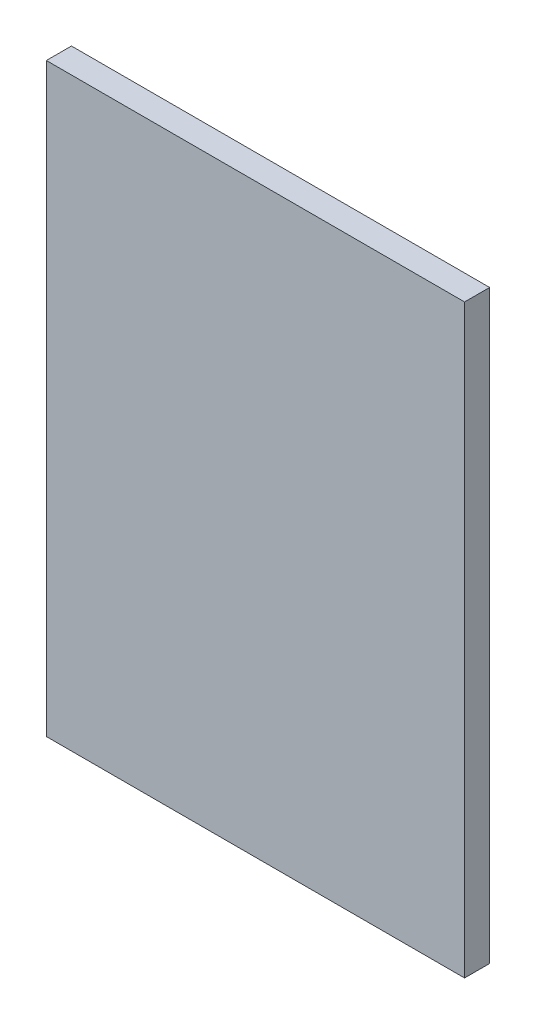
ISO-10303-21;
HEADER;
FILE_DESCRIPTION(('STEP AP214'),'2;1');
FILE_NAME('part.step','',(''),(''),'','','');
FILE_SCHEMA(('AUTOMOTIVE_DESIGN { 1 0 10303 214 1 1 1 1 }'));
ENDSEC;
DATA;
#1=APPLICATION_CONTEXT('core data for automotive mechanical design processes');
#2=APPLICATION_PROTOCOL_DEFINITION('international standard','automotive_design',2000,#1);
#3=PRODUCT_CONTEXT('',#1,'mechanical');
#4=PRODUCT('Part','Part','',(#3));
#5=PRODUCT_RELATED_PRODUCT_CATEGORY('part','',(#4));
#6=PRODUCT_DEFINITION_FORMATION('','',#4);
#7=PRODUCT_DEFINITION_CONTEXT('part definition',#1,'design');
#8=PRODUCT_DEFINITION('design','',#6,#7);
#9=PRODUCT_DEFINITION_SHAPE('','',#8);
#10=(LENGTH_UNIT() NAMED_UNIT(*) SI_UNIT(.MILLI.,.METRE.));
#11=(NAMED_UNIT(*) PLANE_ANGLE_UNIT() SI_UNIT($,.RADIAN.));
#12=(NAMED_UNIT(*) SI_UNIT($,.STERADIAN.) SOLID_ANGLE_UNIT());
#13=UNCERTAINTY_MEASURE_WITH_UNIT(LENGTH_MEASURE(1.E-05),#10,'distance_accuracy_value','');
#14=(GEOMETRIC_REPRESENTATION_CONTEXT(3) GLOBAL_UNCERTAINTY_ASSIGNED_CONTEXT((#13)) GLOBAL_UNIT_ASSIGNED_CONTEXT((#10,
#11,#12)) REPRESENTATION_CONTEXT('',''));
#15=CARTESIAN_POINT('',(0.,0.,0.));
#16=DIRECTION('',(0.,0.,1.));
#17=DIRECTION('',(1.,0.,0.));
#18=AXIS2_PLACEMENT_3D('',#15,#16,#17);
#19=CARTESIAN_POINT('',(-12.5,17.5,1.5));
#20=DIRECTION('',(1.,0.,0.));
#21=DIRECTION('',(0.,0.,-1.));
#22=AXIS2_PLACEMENT_3D('',#19,#20,#21);
#23=PLANE('',#22);
#24=DIRECTION('',(0.,-1.,0.));
#25=VECTOR('',#24,1.);
#26=CARTESIAN_POINT('',(-12.5,17.5,0.));
#27=LINE('',#26,#25);
#28=CARTESIAN_POINT('',(-12.5,17.5,0.));
#29=VERTEX_POINT('',#28);
#30=CARTESIAN_POINT('',(-12.5,-17.5,0.));
#31=VERTEX_POINT('',#30);
#32=EDGE_CURVE('E93',#29,#31,#27,.T.);
#33=ORIENTED_EDGE('',*,*,#32,.T.);
#34=DIRECTION('',(0.,0.,-1.));
#35=VECTOR('',#34,1.);
#36=CARTESIAN_POINT('',(-12.5,-17.5,1.5));
#37=LINE('',#36,#35);
#38=CARTESIAN_POINT('',(-12.5,-17.5,1.5));
#39=VERTEX_POINT('',#38);
#40=EDGE_CURVE('E11',#39,#31,#37,.T.);
#41=ORIENTED_EDGE('',*,*,#40,.F.);
#42=DIRECTION('',(0.,-1.,0.));
#43=VECTOR('',#42,1.);
#44=CARTESIAN_POINT('',(-12.5,17.5,1.5));
#45=LINE('',#44,#43);
#46=CARTESIAN_POINT('',(-12.5,17.5,1.5));
#47=VERTEX_POINT('',#46);
#48=EDGE_CURVE('E81',#47,#39,#45,.T.);
#49=ORIENTED_EDGE('',*,*,#48,.F.);
#50=DIRECTION('',(0.,0.,-1.));
#51=VECTOR('',#50,1.);
#52=CARTESIAN_POINT('',(-12.5,17.5,1.5));
#53=LINE('',#52,#51);
#54=EDGE_CURVE('E89',#47,#29,#53,.T.);
#55=ORIENTED_EDGE('',*,*,#54,.T.);
#56=EDGE_LOOP('',(#33,#41,#49,#55));
#57=FACE_BOUND('',#56,.T.);
#58=ADVANCED_FACE('F30',(#57),#23,.F.);
#59=CARTESIAN_POINT('',(-12.5,-17.5,1.5));
#60=DIRECTION('',(0.,1.,0.));
#61=DIRECTION('',(0.,0.,1.));
#62=AXIS2_PLACEMENT_3D('',#59,#60,#61);
#63=PLANE('',#62);
#64=DIRECTION('',(1.,0.,0.));
#65=VECTOR('',#64,1.);
#66=CARTESIAN_POINT('',(-12.5,-17.5,0.));
#67=LINE('',#66,#65);
#68=CARTESIAN_POINT('',(12.5,-17.5,0.));
#69=VERTEX_POINT('',#68);
#70=EDGE_CURVE('E85',#31,#69,#67,.T.);
#71=ORIENTED_EDGE('',*,*,#70,.T.);
#72=DIRECTION('',(0.,0.,-1.));
#73=VECTOR('',#72,1.);
#74=CARTESIAN_POINT('',(12.5,-17.5,1.5));
#75=LINE('',#74,#73);
#76=CARTESIAN_POINT('',(12.5,-17.5,1.5));
#77=VERTEX_POINT('',#76);
#78=EDGE_CURVE('E38',#77,#69,#75,.T.);
#79=ORIENTED_EDGE('',*,*,#78,.F.);
#80=DIRECTION('',(1.,0.,0.));
#81=VECTOR('',#80,1.);
#82=CARTESIAN_POINT('',(-12.5,-17.5,1.5));
#83=LINE('',#82,#81);
#84=EDGE_CURVE('E76',#39,#77,#83,.T.);
#85=ORIENTED_EDGE('',*,*,#84,.F.);
#86=ORIENTED_EDGE('',*,*,#40,.T.);
#87=EDGE_LOOP('',(#71,#79,#85,#86));
#88=FACE_BOUND('',#87,.T.);
#89=ADVANCED_FACE('F84',(#88),#63,.F.);
#90=CARTESIAN_POINT('',(12.5,17.5,1.5));
#91=DIRECTION('',(-1.,0.,0.));
#92=DIRECTION('',(0.,-1.,0.));
#93=AXIS2_PLACEMENT_3D('',#90,#91,#92);
#94=PLANE('',#93);
#95=DIRECTION('',(0.,1.,0.));
#96=VECTOR('',#95,1.);
#97=CARTESIAN_POINT('',(12.5,17.5,0.));
#98=LINE('',#97,#96);
#99=CARTESIAN_POINT('',(12.5,17.5,0.));
#100=VERTEX_POINT('',#99);
#101=EDGE_CURVE('E63',#69,#100,#98,.T.);
#102=ORIENTED_EDGE('',*,*,#101,.T.);
#103=DIRECTION('',(0.,0.,-1.));
#104=VECTOR('',#103,1.);
#105=CARTESIAN_POINT('',(12.5,17.5,1.5));
#106=LINE('',#105,#104);
#107=CARTESIAN_POINT('',(12.5,17.5,1.5));
#108=VERTEX_POINT('',#107);
#109=EDGE_CURVE('E86',#108,#100,#106,.T.);
#110=ORIENTED_EDGE('',*,*,#109,.F.);
#111=DIRECTION('',(0.,1.,0.));
#112=VECTOR('',#111,1.);
#113=CARTESIAN_POINT('',(12.5,17.5,1.5));
#114=LINE('',#113,#112);
#115=EDGE_CURVE('E79',#77,#108,#114,.T.);
#116=ORIENTED_EDGE('',*,*,#115,.F.);
#117=ORIENTED_EDGE('',*,*,#78,.T.);
#118=EDGE_LOOP('',(#102,#110,#116,#117));
#119=FACE_BOUND('',#118,.T.);
#120=ADVANCED_FACE('F87',(#119),#94,.F.);
#121=CARTESIAN_POINT('',(-12.5,17.5,1.5));
#122=DIRECTION('',(0.,-1.,0.));
#123=DIRECTION('',(0.,0.,-1.));
#124=AXIS2_PLACEMENT_3D('',#121,#122,#123);
#125=PLANE('',#124);
#126=DIRECTION('',(-1.,0.,0.));
#127=VECTOR('',#126,1.);
#128=CARTESIAN_POINT('',(-12.5,17.5,0.));
#129=LINE('',#128,#127);
#130=EDGE_CURVE('E69',#100,#29,#129,.T.);
#131=ORIENTED_EDGE('',*,*,#130,.T.);
#132=ORIENTED_EDGE('',*,*,#54,.F.);
#133=DIRECTION('',(-1.,0.,0.));
#134=VECTOR('',#133,1.);
#135=CARTESIAN_POINT('',(-12.5,17.5,1.5));
#136=LINE('',#135,#134);
#137=EDGE_CURVE('E46',#108,#47,#136,.T.);
#138=ORIENTED_EDGE('',*,*,#137,.F.);
#139=ORIENTED_EDGE('',*,*,#109,.T.);
#140=EDGE_LOOP('',(#131,#132,#138,#139));
#141=FACE_BOUND('',#140,.T.);
#142=ADVANCED_FACE('F100',(#141),#125,.F.);
#143=CARTESIAN_POINT('',(-12.5,-17.5,1.5));
#144=DIRECTION('',(0.,0.,1.));
#145=DIRECTION('',(1.,0.,0.));
#146=AXIS2_PLACEMENT_3D('',#143,#144,#145);
#147=PLANE('',#146);
#148=ORIENTED_EDGE('',*,*,#48,.T.);
#149=ORIENTED_EDGE('',*,*,#84,.T.);
#150=ORIENTED_EDGE('',*,*,#115,.T.);
#151=ORIENTED_EDGE('',*,*,#137,.T.);
#152=EDGE_LOOP('',(#148,#149,#150,#151));
#153=FACE_BOUND('',#152,.T.);
#154=ADVANCED_FACE('F77',(#153),#147,.T.);
#155=CARTESIAN_POINT('',(-12.5,-17.5,0.));
#156=DIRECTION('',(0.,0.,1.));
#157=DIRECTION('',(1.,0.,0.));
#158=AXIS2_PLACEMENT_3D('',#155,#156,#157);
#159=PLANE('',#158);
#160=ORIENTED_EDGE('',*,*,#32,.F.);
#161=ORIENTED_EDGE('',*,*,#130,.F.);
#162=ORIENTED_EDGE('',*,*,#101,.F.);
#163=ORIENTED_EDGE('',*,*,#70,.F.);
#164=EDGE_LOOP('',(#160,#161,#162,#163));
#165=FACE_BOUND('',#164,.T.);
#166=ADVANCED_FACE('F103',(#165),#159,.F.);
#167=CLOSED_SHELL('',(#58,#89,#120,#142,#154,#166));
#168=MANIFOLD_SOLID_BREP('B2',#167);
#169=ADVANCED_BREP_SHAPE_REPRESENTATION('',(#18,#168),#14);
#170=SHAPE_DEFINITION_REPRESENTATION(#9,#169);
ENDSEC;
END-ISO-10303-21;
